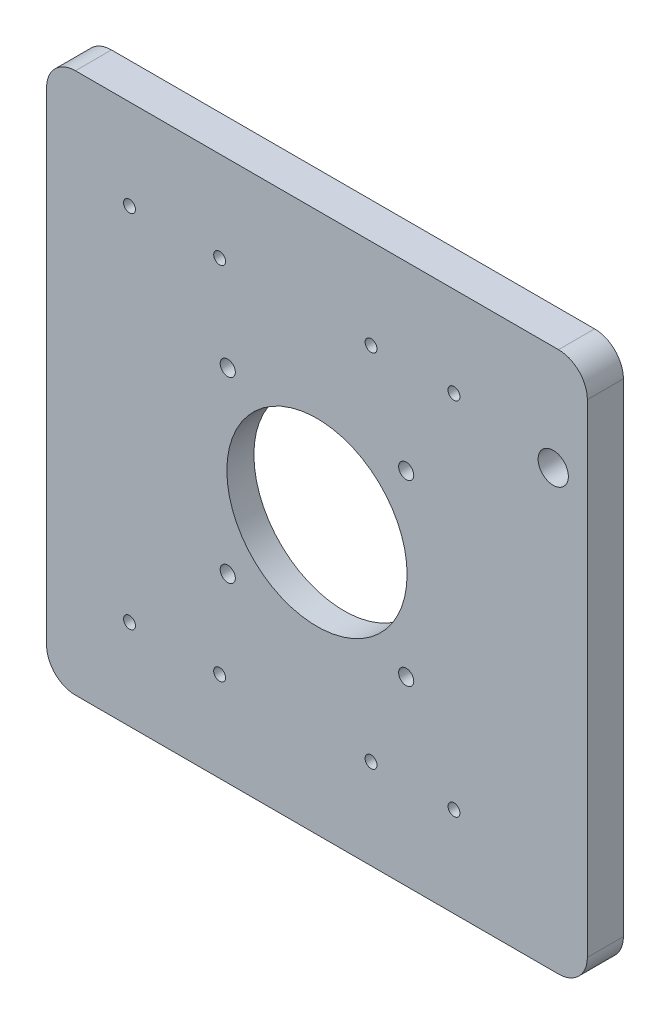
ISO-10303-21;
HEADER;
FILE_DESCRIPTION(('STEP AP214'),'2;1');
FILE_NAME('part.step','',(''),(''),'','','');
FILE_SCHEMA(('AUTOMOTIVE_DESIGN { 1 0 10303 214 1 1 1 1 }'));
ENDSEC;
DATA;
#1=APPLICATION_CONTEXT('core data for automotive mechanical design processes');
#2=APPLICATION_PROTOCOL_DEFINITION('international standard','automotive_design',2000,#1);
#3=PRODUCT_CONTEXT('',#1,'mechanical');
#4=PRODUCT('Part','Part','',(#3));
#5=PRODUCT_RELATED_PRODUCT_CATEGORY('part','',(#4));
#6=PRODUCT_DEFINITION_FORMATION('','',#4);
#7=PRODUCT_DEFINITION_CONTEXT('part definition',#1,'design');
#8=PRODUCT_DEFINITION('design','',#6,#7);
#9=PRODUCT_DEFINITION_SHAPE('','',#8);
#10=(LENGTH_UNIT() NAMED_UNIT(*) SI_UNIT(.MILLI.,.METRE.));
#11=(NAMED_UNIT(*) PLANE_ANGLE_UNIT() SI_UNIT($,.RADIAN.));
#12=(NAMED_UNIT(*) SI_UNIT($,.STERADIAN.) SOLID_ANGLE_UNIT());
#13=UNCERTAINTY_MEASURE_WITH_UNIT(LENGTH_MEASURE(1.E-05),#10,'distance_accuracy_value','');
#14=(GEOMETRIC_REPRESENTATION_CONTEXT(3) GLOBAL_UNCERTAINTY_ASSIGNED_CONTEXT((#13)) GLOBAL_UNIT_ASSIGNED_CONTEXT((#10,
#11,#12)) REPRESENTATION_CONTEXT('',''));
#15=CARTESIAN_POINT('',(0.,0.,0.));
#16=DIRECTION('',(0.,0.,1.));
#17=DIRECTION('',(1.,0.,0.));
#18=AXIS2_PLACEMENT_3D('',#15,#16,#17);
#19=CARTESIAN_POINT('',(0.,0.,2.5));
#20=DIRECTION('',(0.,0.,-1.));
#21=DIRECTION('',(-1.,0.,0.));
#22=AXIS2_PLACEMENT_3D('',#19,#20,#21);
#23=CYLINDRICAL_SURFACE('',#22,50.);
#24=CARTESIAN_POINT('',(0.,0.,0.));
#25=DIRECTION('',(0.,0.,-1.));
#26=DIRECTION('',(-1.,0.,0.));
#27=AXIS2_PLACEMENT_3D('',#24,#25,#26);
#28=CIRCLE('',#27,50.);
#29=CARTESIAN_POINT('',(-50.,0.,0.));
#30=VERTEX_POINT('',#29);
#31=EDGE_CURVE('E19',#30,#30,#28,.T.);
#32=ORIENTED_EDGE('',*,*,#31,.T.);
#33=EDGE_LOOP('',(#32));
#34=FACE_BOUND('',#33,.T.);
#35=CARTESIAN_POINT('',(0.,0.,2.5));
#36=DIRECTION('',(0.,0.,-1.));
#37=DIRECTION('',(-1.,0.,0.));
#38=AXIS2_PLACEMENT_3D('',#35,#36,#37);
#39=CIRCLE('',#38,50.);
#40=CARTESIAN_POINT('',(-50.,0.,2.5));
#41=VERTEX_POINT('',#40);
#42=EDGE_CURVE('E215',#41,#41,#39,.T.);
#43=ORIENTED_EDGE('',*,*,#42,.F.);
#44=EDGE_LOOP('',(#43));
#45=FACE_BOUND('',#44,.T.);
#46=ADVANCED_FACE('F16',(#34,#45),#23,.F.);
#47=CARTESIAN_POINT('',(-67.,67.,0.));
#48=DIRECTION('',(0.,0.,1.));
#49=DIRECTION('',(1.,0.,0.));
#50=AXIS2_PLACEMENT_3D('',#47,#48,#49);
#51=PLANE('',#50);
#52=DIRECTION('',(1.,0.,0.));
#53=VECTOR('',#52,1.);
#54=CARTESIAN_POINT('',(-67.,75.,0.));
#55=LINE('',#54,#53);
#56=CARTESIAN_POINT('',(-67.,75.,0.));
#57=VERTEX_POINT('',#56);
#58=CARTESIAN_POINT('',(67.,75.,0.));
#59=VERTEX_POINT('',#58);
#60=EDGE_CURVE('E84',#57,#59,#55,.T.);
#61=ORIENTED_EDGE('',*,*,#60,.T.);
#62=CARTESIAN_POINT('',(67.,67.,0.));
#63=DIRECTION('',(0.,0.,-1.));
#64=DIRECTION('',(-1.,0.,0.));
#65=AXIS2_PLACEMENT_3D('',#62,#63,#64);
#66=CIRCLE('',#65,7.99999999999999);
#67=CARTESIAN_POINT('',(75.,67.,0.));
#68=VERTEX_POINT('',#67);
#69=EDGE_CURVE('E112',#68,#59,#66,.F.);
#70=ORIENTED_EDGE('',*,*,#69,.F.);
#71=DIRECTION('',(0.,-1.,0.));
#72=VECTOR('',#71,1.);
#73=CARTESIAN_POINT('',(75.,67.,0.));
#74=LINE('',#73,#72);
#75=CARTESIAN_POINT('',(75.,-67.,0.));
#76=VERTEX_POINT('',#75);
#77=EDGE_CURVE('E109',#68,#76,#74,.T.);
#78=ORIENTED_EDGE('',*,*,#77,.T.);
#79=CARTESIAN_POINT('',(67.,-67.,0.));
#80=DIRECTION('',(0.,0.,-1.));
#81=DIRECTION('',(-1.,0.,0.));
#82=AXIS2_PLACEMENT_3D('',#79,#80,#81);
#83=CIRCLE('',#82,8.00000000000001);
#84=CARTESIAN_POINT('',(67.,-75.,0.));
#85=VERTEX_POINT('',#84);
#86=EDGE_CURVE('E117',#85,#76,#83,.F.);
#87=ORIENTED_EDGE('',*,*,#86,.F.);
#88=DIRECTION('',(-1.,0.,0.));
#89=VECTOR('',#88,1.);
#90=CARTESIAN_POINT('',(67.,-75.,0.));
#91=LINE('',#90,#89);
#92=CARTESIAN_POINT('',(-67.,-75.,0.));
#93=VERTEX_POINT('',#92);
#94=EDGE_CURVE('E114',#85,#93,#91,.T.);
#95=ORIENTED_EDGE('',*,*,#94,.T.);
#96=CARTESIAN_POINT('',(-67.,-67.,0.));
#97=DIRECTION('',(0.,0.,-1.));
#98=DIRECTION('',(-1.,0.,0.));
#99=AXIS2_PLACEMENT_3D('',#96,#97,#98);
#100=CIRCLE('',#99,7.99999999999999);
#101=CARTESIAN_POINT('',(-75.,-67.,0.));
#102=VERTEX_POINT('',#101);
#103=EDGE_CURVE('E119',#102,#93,#100,.F.);
#104=ORIENTED_EDGE('',*,*,#103,.F.);
#105=DIRECTION('',(0.,1.,0.));
#106=VECTOR('',#105,1.);
#107=CARTESIAN_POINT('',(-75.,-67.,0.));
#108=LINE('',#107,#106);
#109=CARTESIAN_POINT('',(-75.,67.,0.));
#110=VERTEX_POINT('',#109);
#111=EDGE_CURVE('E86',#102,#110,#108,.T.);
#112=ORIENTED_EDGE('',*,*,#111,.T.);
#113=CARTESIAN_POINT('',(-67.,67.,0.));
#114=DIRECTION('',(0.,0.,-1.));
#115=DIRECTION('',(-1.,0.,0.));
#116=AXIS2_PLACEMENT_3D('',#113,#114,#115);
#117=CIRCLE('',#116,7.99999999999998);
#118=EDGE_CURVE('E79',#57,#110,#117,.F.);
#119=ORIENTED_EDGE('',*,*,#118,.F.);
#120=EDGE_LOOP('',(#61,#70,#78,#87,#95,#104,#112,#119));
#121=FACE_BOUND('',#120,.T.);
#122=CARTESIAN_POINT('',(-27.,50.,0.));
#123=DIRECTION('',(0.,0.,1.));
#124=DIRECTION('',(1.,0.,0.));
#125=AXIS2_PLACEMENT_3D('',#122,#123,#124);
#126=CIRCLE('',#125,1.65);
#127=CARTESIAN_POINT('',(-25.35,50.,0.));
#128=VERTEX_POINT('',#127);
#129=EDGE_CURVE('E90',#128,#128,#126,.T.);
#130=ORIENTED_EDGE('',*,*,#129,.T.);
#131=EDGE_LOOP('',(#130));
#132=FACE_BOUND('',#131,.T.);
#133=CARTESIAN_POINT('',(-27.,-50.,0.));
#134=DIRECTION('',(0.,0.,1.));
#135=DIRECTION('',(1.,0.,0.));
#136=AXIS2_PLACEMENT_3D('',#133,#134,#135);
#137=CIRCLE('',#136,1.65);
#138=CARTESIAN_POINT('',(-25.35,-50.,0.));
#139=VERTEX_POINT('',#138);
#140=EDGE_CURVE('E180',#139,#139,#137,.T.);
#141=ORIENTED_EDGE('',*,*,#140,.T.);
#142=EDGE_LOOP('',(#141));
#143=FACE_BOUND('',#142,.T.);
#144=CARTESIAN_POINT('',(15.,-50.,0.));
#145=DIRECTION('',(0.,0.,1.));
#146=DIRECTION('',(1.,0.,0.));
#147=AXIS2_PLACEMENT_3D('',#144,#145,#146);
#148=CIRCLE('',#147,1.65);
#149=CARTESIAN_POINT('',(16.65,-50.,0.));
#150=VERTEX_POINT('',#149);
#151=EDGE_CURVE('E183',#150,#150,#148,.T.);
#152=ORIENTED_EDGE('',*,*,#151,.T.);
#153=EDGE_LOOP('',(#152));
#154=FACE_BOUND('',#153,.T.);
#155=CARTESIAN_POINT('',(15.,50.,0.));
#156=DIRECTION('',(0.,0.,1.));
#157=DIRECTION('',(1.,0.,0.));
#158=AXIS2_PLACEMENT_3D('',#155,#156,#157);
#159=CIRCLE('',#158,1.65);
#160=CARTESIAN_POINT('',(16.65,50.,0.));
#161=VERTEX_POINT('',#160);
#162=EDGE_CURVE('E186',#161,#161,#159,.T.);
#163=ORIENTED_EDGE('',*,*,#162,.T.);
#164=EDGE_LOOP('',(#163));
#165=FACE_BOUND('',#164,.T.);
#166=CARTESIAN_POINT('',(38.,-50.,0.));
#167=DIRECTION('',(0.,0.,1.));
#168=DIRECTION('',(1.,0.,0.));
#169=AXIS2_PLACEMENT_3D('',#166,#167,#168);
#170=CIRCLE('',#169,1.65);
#171=CARTESIAN_POINT('',(39.65,-50.,0.));
#172=VERTEX_POINT('',#171);
#173=EDGE_CURVE('E189',#172,#172,#170,.T.);
#174=ORIENTED_EDGE('',*,*,#173,.T.);
#175=EDGE_LOOP('',(#174));
#176=FACE_BOUND('',#175,.T.);
#177=CARTESIAN_POINT('',(-52.,-50.,0.));
#178=DIRECTION('',(0.,0.,1.));
#179=DIRECTION('',(1.,0.,0.));
#180=AXIS2_PLACEMENT_3D('',#177,#178,#179);
#181=CIRCLE('',#180,1.65);
#182=CARTESIAN_POINT('',(-50.35,-50.,0.));
#183=VERTEX_POINT('',#182);
#184=EDGE_CURVE('E192',#183,#183,#181,.T.);
#185=ORIENTED_EDGE('',*,*,#184,.T.);
#186=EDGE_LOOP('',(#185));
#187=FACE_BOUND('',#186,.T.);
#188=CARTESIAN_POINT('',(38.,50.,0.));
#189=DIRECTION('',(0.,0.,1.));
#190=DIRECTION('',(1.,0.,0.));
#191=AXIS2_PLACEMENT_3D('',#188,#189,#190);
#192=CIRCLE('',#191,1.65);
#193=CARTESIAN_POINT('',(39.65,50.,0.));
#194=VERTEX_POINT('',#193);
#195=EDGE_CURVE('E195',#194,#194,#192,.T.);
#196=ORIENTED_EDGE('',*,*,#195,.T.);
#197=EDGE_LOOP('',(#196));
#198=FACE_BOUND('',#197,.T.);
#199=CARTESIAN_POINT('',(-52.,50.,0.));
#200=DIRECTION('',(0.,0.,1.));
#201=DIRECTION('',(1.,0.,0.));
#202=AXIS2_PLACEMENT_3D('',#199,#200,#201);
#203=CIRCLE('',#202,1.65);
#204=CARTESIAN_POINT('',(-50.35,50.,0.));
#205=VERTEX_POINT('',#204);
#206=EDGE_CURVE('E198',#205,#205,#203,.T.);
#207=ORIENTED_EDGE('',*,*,#206,.T.);
#208=EDGE_LOOP('',(#207));
#209=FACE_BOUND('',#208,.T.);
#210=ORIENTED_EDGE('',*,*,#31,.F.);
#211=EDGE_LOOP('',(#210));
#212=FACE_BOUND('',#211,.T.);
#213=CARTESIAN_POINT('',(65.5321635431193,45.8861149080838,0.));
#214=DIRECTION('',(0.,0.,1.));
#215=DIRECTION('',(1.,0.,0.));
#216=AXIS2_PLACEMENT_3D('',#213,#214,#215);
#217=CIRCLE('',#216,4.2);
#218=CARTESIAN_POINT('',(69.7321635431193,45.8861149080838,0.));
#219=VERTEX_POINT('',#218);
#220=EDGE_CURVE('E201',#219,#219,#217,.T.);
#221=ORIENTED_EDGE('',*,*,#220,.T.);
#222=EDGE_LOOP('',(#221));
#223=FACE_BOUND('',#222,.T.);
#224=ADVANCED_FACE('F81',(#121,#132,#143,#154,#165,#176,#187,#198,#209,#212,#223),#51,.F.);
#225=CARTESIAN_POINT('',(0.,0.,2.5));
#226=DIRECTION('',(0.,0.,-1.));
#227=DIRECTION('',(-1.,0.,0.));
#228=AXIS2_PLACEMENT_3D('',#225,#226,#227);
#229=PLANE('',#228);
#230=ORIENTED_EDGE('',*,*,#42,.T.);
#231=EDGE_LOOP('',(#230));
#232=FACE_BOUND('',#231,.T.);
#233=CARTESIAN_POINT('',(0.,0.,2.5));
#234=DIRECTION('',(0.,0.,-1.));
#235=DIRECTION('',(-1.,0.,0.));
#236=AXIS2_PLACEMENT_3D('',#233,#234,#235);
#237=CIRCLE('',#236,25.);
#238=CARTESIAN_POINT('',(-25.,0.,2.5));
#239=VERTEX_POINT('',#238);
#240=EDGE_CURVE('E101',#239,#239,#237,.F.);
#241=ORIENTED_EDGE('',*,*,#240,.T.);
#242=EDGE_LOOP('',(#241));
#243=FACE_BOUND('',#242,.T.);
#244=CARTESIAN_POINT('',(24.75,-24.75,2.5));
#245=DIRECTION('',(0.,0.,1.));
#246=DIRECTION('',(1.,0.,0.));
#247=AXIS2_PLACEMENT_3D('',#244,#245,#246);
#248=CIRCLE('',#247,2.09999999999999);
#249=CARTESIAN_POINT('',(26.85,-24.75,2.5));
#250=VERTEX_POINT('',#249);
#251=EDGE_CURVE('E204',#250,#250,#248,.T.);
#252=ORIENTED_EDGE('',*,*,#251,.T.);
#253=EDGE_LOOP('',(#252));
#254=FACE_BOUND('',#253,.T.);
#255=CARTESIAN_POINT('',(-24.75,-24.75,2.5));
#256=DIRECTION('',(0.,0.,1.));
#257=DIRECTION('',(1.,0.,0.));
#258=AXIS2_PLACEMENT_3D('',#255,#256,#257);
#259=CIRCLE('',#258,2.09999999999999);
#260=CARTESIAN_POINT('',(-22.65,-24.75,2.5));
#261=VERTEX_POINT('',#260);
#262=EDGE_CURVE('E207',#261,#261,#259,.T.);
#263=ORIENTED_EDGE('',*,*,#262,.T.);
#264=EDGE_LOOP('',(#263));
#265=FACE_BOUND('',#264,.T.);
#266=CARTESIAN_POINT('',(24.75,24.75,2.5));
#267=DIRECTION('',(0.,0.,1.));
#268=DIRECTION('',(1.,0.,0.));
#269=AXIS2_PLACEMENT_3D('',#266,#267,#268);
#270=CIRCLE('',#269,2.09999999999999);
#271=CARTESIAN_POINT('',(26.85,24.75,2.5));
#272=VERTEX_POINT('',#271);
#273=EDGE_CURVE('E210',#272,#272,#270,.T.);
#274=ORIENTED_EDGE('',*,*,#273,.T.);
#275=EDGE_LOOP('',(#274));
#276=FACE_BOUND('',#275,.T.);
#277=CARTESIAN_POINT('',(-24.75,24.75,2.5));
#278=DIRECTION('',(0.,0.,1.));
#279=DIRECTION('',(1.,0.,0.));
#280=AXIS2_PLACEMENT_3D('',#277,#278,#279);
#281=CIRCLE('',#280,2.09999999999999);
#282=CARTESIAN_POINT('',(-22.65,24.75,2.5));
#283=VERTEX_POINT('',#282);
#284=EDGE_CURVE('E213',#283,#283,#281,.T.);
#285=ORIENTED_EDGE('',*,*,#284,.T.);
#286=EDGE_LOOP('',(#285));
#287=FACE_BOUND('',#286,.T.);
#288=ADVANCED_FACE('F226',(#232,#243,#254,#265,#276,#287),#229,.T.);
#289=CARTESIAN_POINT('',(-24.75,24.75,10.));
#290=DIRECTION('',(0.,0.,1.));
#291=DIRECTION('',(1.,0.,0.));
#292=AXIS2_PLACEMENT_3D('',#289,#290,#291);
#293=CYLINDRICAL_SURFACE('',#292,2.09999999999999);
#294=CARTESIAN_POINT('',(-24.75,24.75,10.));
#295=DIRECTION('',(0.,0.,1.));
#296=DIRECTION('',(1.,0.,0.));
#297=AXIS2_PLACEMENT_3D('',#294,#295,#296);
#298=CIRCLE('',#297,2.09999999999999);
#299=CARTESIAN_POINT('',(-22.65,24.75,10.));
#300=VERTEX_POINT('',#299);
#301=EDGE_CURVE('E104',#300,#300,#298,.F.);
#302=ORIENTED_EDGE('',*,*,#301,.F.);
#303=EDGE_LOOP('',(#302));
#304=FACE_BOUND('',#303,.T.);
#305=ORIENTED_EDGE('',*,*,#284,.F.);
#306=EDGE_LOOP('',(#305));
#307=FACE_BOUND('',#306,.T.);
#308=ADVANCED_FACE('F334',(#304,#307),#293,.F.);
#309=CARTESIAN_POINT('',(24.75,24.75,10.));
#310=DIRECTION('',(0.,0.,1.));
#311=DIRECTION('',(1.,0.,0.));
#312=AXIS2_PLACEMENT_3D('',#309,#310,#311);
#313=CYLINDRICAL_SURFACE('',#312,2.09999999999999);
#314=CARTESIAN_POINT('',(24.75,24.75,10.));
#315=DIRECTION('',(0.,0.,1.));
#316=DIRECTION('',(1.,0.,0.));
#317=AXIS2_PLACEMENT_3D('',#314,#315,#316);
#318=CIRCLE('',#317,2.09999999999999);
#319=CARTESIAN_POINT('',(26.85,24.75,10.));
#320=VERTEX_POINT('',#319);
#321=EDGE_CURVE('E167',#320,#320,#318,.F.);
#322=ORIENTED_EDGE('',*,*,#321,.F.);
#323=EDGE_LOOP('',(#322));
#324=FACE_BOUND('',#323,.T.);
#325=ORIENTED_EDGE('',*,*,#273,.F.);
#326=EDGE_LOOP('',(#325));
#327=FACE_BOUND('',#326,.T.);
#328=ADVANCED_FACE('F337',(#324,#327),#313,.F.);
#329=CARTESIAN_POINT('',(-24.75,-24.75,10.));
#330=DIRECTION('',(0.,0.,1.));
#331=DIRECTION('',(1.,0.,0.));
#332=AXIS2_PLACEMENT_3D('',#329,#330,#331);
#333=CYLINDRICAL_SURFACE('',#332,2.09999999999999);
#334=CARTESIAN_POINT('',(-24.75,-24.75,10.));
#335=DIRECTION('',(0.,0.,1.));
#336=DIRECTION('',(1.,0.,0.));
#337=AXIS2_PLACEMENT_3D('',#334,#335,#336);
#338=CIRCLE('',#337,2.09999999999999);
#339=CARTESIAN_POINT('',(-22.65,-24.75,10.));
#340=VERTEX_POINT('',#339);
#341=EDGE_CURVE('E164',#340,#340,#338,.F.);
#342=ORIENTED_EDGE('',*,*,#341,.F.);
#343=EDGE_LOOP('',(#342));
#344=FACE_BOUND('',#343,.T.);
#345=ORIENTED_EDGE('',*,*,#262,.F.);
#346=EDGE_LOOP('',(#345));
#347=FACE_BOUND('',#346,.T.);
#348=ADVANCED_FACE('F243',(#344,#347),#333,.F.);
#349=CARTESIAN_POINT('',(24.75,-24.75,10.));
#350=DIRECTION('',(0.,0.,1.));
#351=DIRECTION('',(1.,0.,0.));
#352=AXIS2_PLACEMENT_3D('',#349,#350,#351);
#353=CYLINDRICAL_SURFACE('',#352,2.09999999999999);
#354=CARTESIAN_POINT('',(24.75,-24.75,10.));
#355=DIRECTION('',(0.,0.,1.));
#356=DIRECTION('',(1.,0.,0.));
#357=AXIS2_PLACEMENT_3D('',#354,#355,#356);
#358=CIRCLE('',#357,2.09999999999999);
#359=CARTESIAN_POINT('',(26.85,-24.75,10.));
#360=VERTEX_POINT('',#359);
#361=EDGE_CURVE('E161',#360,#360,#358,.F.);
#362=ORIENTED_EDGE('',*,*,#361,.F.);
#363=EDGE_LOOP('',(#362));
#364=FACE_BOUND('',#363,.T.);
#365=ORIENTED_EDGE('',*,*,#251,.F.);
#366=EDGE_LOOP('',(#365));
#367=FACE_BOUND('',#366,.T.);
#368=ADVANCED_FACE('F232',(#364,#367),#353,.F.);
#369=CARTESIAN_POINT('',(65.5321635431193,45.8861149080838,10.));
#370=DIRECTION('',(0.,0.,1.));
#371=DIRECTION('',(1.,0.,0.));
#372=AXIS2_PLACEMENT_3D('',#369,#370,#371);
#373=CYLINDRICAL_SURFACE('',#372,4.2);
#374=CARTESIAN_POINT('',(65.5321635431193,45.8861149080838,10.));
#375=DIRECTION('',(0.,0.,1.));
#376=DIRECTION('',(1.,0.,0.));
#377=AXIS2_PLACEMENT_3D('',#374,#375,#376);
#378=CIRCLE('',#377,4.2);
#379=CARTESIAN_POINT('',(69.7321635431193,45.8861149080838,10.));
#380=VERTEX_POINT('',#379);
#381=EDGE_CURVE('E158',#380,#380,#378,.F.);
#382=ORIENTED_EDGE('',*,*,#381,.F.);
#383=EDGE_LOOP('',(#382));
#384=FACE_BOUND('',#383,.T.);
#385=ORIENTED_EDGE('',*,*,#220,.F.);
#386=EDGE_LOOP('',(#385));
#387=FACE_BOUND('',#386,.T.);
#388=ADVANCED_FACE('F229',(#384,#387),#373,.F.);
#389=CARTESIAN_POINT('',(-52.,50.,10.));
#390=DIRECTION('',(0.,0.,1.));
#391=DIRECTION('',(1.,0.,0.));
#392=AXIS2_PLACEMENT_3D('',#389,#390,#391);
#393=CYLINDRICAL_SURFACE('',#392,1.65);
#394=CARTESIAN_POINT('',(-52.,50.,10.));
#395=DIRECTION('',(0.,0.,1.));
#396=DIRECTION('',(1.,0.,0.));
#397=AXIS2_PLACEMENT_3D('',#394,#395,#396);
#398=CIRCLE('',#397,1.65);
#399=CARTESIAN_POINT('',(-50.35,50.,10.));
#400=VERTEX_POINT('',#399);
#401=EDGE_CURVE('E155',#400,#400,#398,.F.);
#402=ORIENTED_EDGE('',*,*,#401,.F.);
#403=EDGE_LOOP('',(#402));
#404=FACE_BOUND('',#403,.T.);
#405=ORIENTED_EDGE('',*,*,#206,.F.);
#406=EDGE_LOOP('',(#405));
#407=FACE_BOUND('',#406,.T.);
#408=ADVANCED_FACE('F231',(#404,#407),#393,.F.);
#409=CARTESIAN_POINT('',(38.,50.,10.));
#410=DIRECTION('',(0.,0.,1.));
#411=DIRECTION('',(1.,0.,0.));
#412=AXIS2_PLACEMENT_3D('',#409,#410,#411);
#413=CYLINDRICAL_SURFACE('',#412,1.65);
#414=CARTESIAN_POINT('',(38.,50.,10.));
#415=DIRECTION('',(0.,0.,1.));
#416=DIRECTION('',(1.,0.,0.));
#417=AXIS2_PLACEMENT_3D('',#414,#415,#416);
#418=CIRCLE('',#417,1.65);
#419=CARTESIAN_POINT('',(39.65,50.,10.));
#420=VERTEX_POINT('',#419);
#421=EDGE_CURVE('E152',#420,#420,#418,.F.);
#422=ORIENTED_EDGE('',*,*,#421,.F.);
#423=EDGE_LOOP('',(#422));
#424=FACE_BOUND('',#423,.T.);
#425=ORIENTED_EDGE('',*,*,#195,.F.);
#426=EDGE_LOOP('',(#425));
#427=FACE_BOUND('',#426,.T.);
#428=ADVANCED_FACE('F240',(#424,#427),#413,.F.);
#429=CARTESIAN_POINT('',(-52.,-50.,10.));
#430=DIRECTION('',(0.,0.,1.));
#431=DIRECTION('',(1.,0.,0.));
#432=AXIS2_PLACEMENT_3D('',#429,#430,#431);
#433=CYLINDRICAL_SURFACE('',#432,1.65);
#434=CARTESIAN_POINT('',(-52.,-50.,10.));
#435=DIRECTION('',(0.,0.,1.));
#436=DIRECTION('',(1.,0.,0.));
#437=AXIS2_PLACEMENT_3D('',#434,#435,#436);
#438=CIRCLE('',#437,1.65);
#439=CARTESIAN_POINT('',(-50.35,-50.,10.));
#440=VERTEX_POINT('',#439);
#441=EDGE_CURVE('E149',#440,#440,#438,.F.);
#442=ORIENTED_EDGE('',*,*,#441,.F.);
#443=EDGE_LOOP('',(#442));
#444=FACE_BOUND('',#443,.T.);
#445=ORIENTED_EDGE('',*,*,#184,.F.);
#446=EDGE_LOOP('',(#445));
#447=FACE_BOUND('',#446,.T.);
#448=ADVANCED_FACE('F305',(#444,#447),#433,.F.);
#449=CARTESIAN_POINT('',(38.,-50.,10.));
#450=DIRECTION('',(0.,0.,1.));
#451=DIRECTION('',(1.,0.,0.));
#452=AXIS2_PLACEMENT_3D('',#449,#450,#451);
#453=CYLINDRICAL_SURFACE('',#452,1.65);
#454=CARTESIAN_POINT('',(38.,-50.,10.));
#455=DIRECTION('',(0.,0.,1.));
#456=DIRECTION('',(1.,0.,0.));
#457=AXIS2_PLACEMENT_3D('',#454,#455,#456);
#458=CIRCLE('',#457,1.65);
#459=CARTESIAN_POINT('',(39.65,-50.,10.));
#460=VERTEX_POINT('',#459);
#461=EDGE_CURVE('E146',#460,#460,#458,.F.);
#462=ORIENTED_EDGE('',*,*,#461,.F.);
#463=EDGE_LOOP('',(#462));
#464=FACE_BOUND('',#463,.T.);
#465=ORIENTED_EDGE('',*,*,#173,.F.);
#466=EDGE_LOOP('',(#465));
#467=FACE_BOUND('',#466,.T.);
#468=ADVANCED_FACE('F301',(#464,#467),#453,.F.);
#469=CARTESIAN_POINT('',(15.,50.,10.));
#470=DIRECTION('',(0.,0.,1.));
#471=DIRECTION('',(1.,0.,0.));
#472=AXIS2_PLACEMENT_3D('',#469,#470,#471);
#473=CYLINDRICAL_SURFACE('',#472,1.65);
#474=CARTESIAN_POINT('',(15.,50.,10.));
#475=DIRECTION('',(0.,0.,1.));
#476=DIRECTION('',(1.,0.,0.));
#477=AXIS2_PLACEMENT_3D('',#474,#475,#476);
#478=CIRCLE('',#477,1.65);
#479=CARTESIAN_POINT('',(16.65,50.,10.));
#480=VERTEX_POINT('',#479);
#481=EDGE_CURVE('E143',#480,#480,#478,.F.);
#482=ORIENTED_EDGE('',*,*,#481,.F.);
#483=EDGE_LOOP('',(#482));
#484=FACE_BOUND('',#483,.T.);
#485=ORIENTED_EDGE('',*,*,#162,.F.);
#486=EDGE_LOOP('',(#485));
#487=FACE_BOUND('',#486,.T.);
#488=ADVANCED_FACE('F297',(#484,#487),#473,.F.);
#489=CARTESIAN_POINT('',(15.,-50.,10.));
#490=DIRECTION('',(0.,0.,1.));
#491=DIRECTION('',(1.,0.,0.));
#492=AXIS2_PLACEMENT_3D('',#489,#490,#491);
#493=CYLINDRICAL_SURFACE('',#492,1.65);
#494=CARTESIAN_POINT('',(15.,-50.,10.));
#495=DIRECTION('',(0.,0.,1.));
#496=DIRECTION('',(1.,0.,0.));
#497=AXIS2_PLACEMENT_3D('',#494,#495,#496);
#498=CIRCLE('',#497,1.65);
#499=CARTESIAN_POINT('',(16.65,-50.,10.));
#500=VERTEX_POINT('',#499);
#501=EDGE_CURVE('E140',#500,#500,#498,.F.);
#502=ORIENTED_EDGE('',*,*,#501,.F.);
#503=EDGE_LOOP('',(#502));
#504=FACE_BOUND('',#503,.T.);
#505=ORIENTED_EDGE('',*,*,#151,.F.);
#506=EDGE_LOOP('',(#505));
#507=FACE_BOUND('',#506,.T.);
#508=ADVANCED_FACE('F293',(#504,#507),#493,.F.);
#509=CARTESIAN_POINT('',(-27.,-50.,10.));
#510=DIRECTION('',(0.,0.,1.));
#511=DIRECTION('',(1.,0.,0.));
#512=AXIS2_PLACEMENT_3D('',#509,#510,#511);
#513=CYLINDRICAL_SURFACE('',#512,1.65);
#514=CARTESIAN_POINT('',(-27.,-50.,10.));
#515=DIRECTION('',(0.,0.,1.));
#516=DIRECTION('',(1.,0.,0.));
#517=AXIS2_PLACEMENT_3D('',#514,#515,#516);
#518=CIRCLE('',#517,1.65);
#519=CARTESIAN_POINT('',(-25.35,-50.,10.));
#520=VERTEX_POINT('',#519);
#521=EDGE_CURVE('E137',#520,#520,#518,.F.);
#522=ORIENTED_EDGE('',*,*,#521,.F.);
#523=EDGE_LOOP('',(#522));
#524=FACE_BOUND('',#523,.T.);
#525=ORIENTED_EDGE('',*,*,#140,.F.);
#526=EDGE_LOOP('',(#525));
#527=FACE_BOUND('',#526,.T.);
#528=ADVANCED_FACE('F289',(#524,#527),#513,.F.);
#529=CARTESIAN_POINT('',(-27.,50.,10.));
#530=DIRECTION('',(0.,0.,1.));
#531=DIRECTION('',(1.,0.,0.));
#532=AXIS2_PLACEMENT_3D('',#529,#530,#531);
#533=CYLINDRICAL_SURFACE('',#532,1.65);
#534=CARTESIAN_POINT('',(-27.,50.,10.));
#535=DIRECTION('',(0.,0.,1.));
#536=DIRECTION('',(1.,0.,0.));
#537=AXIS2_PLACEMENT_3D('',#534,#535,#536);
#538=CIRCLE('',#537,1.65);
#539=CARTESIAN_POINT('',(-25.35,50.,10.));
#540=VERTEX_POINT('',#539);
#541=EDGE_CURVE('E134',#540,#540,#538,.F.);
#542=ORIENTED_EDGE('',*,*,#541,.F.);
#543=EDGE_LOOP('',(#542));
#544=FACE_BOUND('',#543,.T.);
#545=ORIENTED_EDGE('',*,*,#129,.F.);
#546=EDGE_LOOP('',(#545));
#547=FACE_BOUND('',#546,.T.);
#548=ADVANCED_FACE('F286',(#544,#547),#533,.F.);
#549=CARTESIAN_POINT('',(-67.,67.,10.));
#550=DIRECTION('',(0.,0.,-1.));
#551=DIRECTION('',(-1.,0.,0.));
#552=AXIS2_PLACEMENT_3D('',#549,#550,#551);
#553=CYLINDRICAL_SURFACE('',#552,7.99999999999998);
#554=CARTESIAN_POINT('',(-67.,67.,10.));
#555=DIRECTION('',(0.,0.,-1.));
#556=DIRECTION('',(-1.,0.,0.));
#557=AXIS2_PLACEMENT_3D('',#554,#555,#556);
#558=CIRCLE('',#557,7.99999999999998);
#559=CARTESIAN_POINT('',(-67.,75.,10.));
#560=VERTEX_POINT('',#559);
#561=CARTESIAN_POINT('',(-75.,67.,10.));
#562=VERTEX_POINT('',#561);
#563=EDGE_CURVE('E96',#560,#562,#558,.F.);
#564=ORIENTED_EDGE('',*,*,#563,.F.);
#565=DIRECTION('',(0.,0.,1.));
#566=VECTOR('',#565,1.);
#567=CARTESIAN_POINT('',(-67.,75.,10.));
#568=LINE('',#567,#566);
#569=EDGE_CURVE('E93',#560,#57,#568,.F.);
#570=ORIENTED_EDGE('',*,*,#569,.T.);
#571=ORIENTED_EDGE('',*,*,#118,.T.);
#572=DIRECTION('',(0.,0.,-1.));
#573=VECTOR('',#572,1.);
#574=CARTESIAN_POINT('',(-75.,67.,10.));
#575=LINE('',#574,#573);
#576=EDGE_CURVE('E89',#110,#562,#575,.F.);
#577=ORIENTED_EDGE('',*,*,#576,.T.);
#578=EDGE_LOOP('',(#564,#570,#571,#577));
#579=FACE_BOUND('',#578,.T.);
#580=ADVANCED_FACE('F94',(#579),#553,.T.);
#581=CARTESIAN_POINT('',(-75.,-67.,10.));
#582=DIRECTION('',(1.,0.,0.));
#583=DIRECTION('',(0.,0.,-1.));
#584=AXIS2_PLACEMENT_3D('',#581,#582,#583);
#585=PLANE('',#584);
#586=DIRECTION('',(0.,0.,-1.));
#587=VECTOR('',#586,1.);
#588=CARTESIAN_POINT('',(-75.,-67.,10.));
#589=LINE('',#588,#587);
#590=CARTESIAN_POINT('',(-75.,-67.,10.));
#591=VERTEX_POINT('',#590);
#592=EDGE_CURVE('E176',#591,#102,#589,.T.);
#593=ORIENTED_EDGE('',*,*,#592,.F.);
#594=DIRECTION('',(0.,1.,0.));
#595=VECTOR('',#594,1.);
#596=CARTESIAN_POINT('',(-75.,67.,10.));
#597=LINE('',#596,#595);
#598=EDGE_CURVE('E132',#562,#591,#597,.F.);
#599=ORIENTED_EDGE('',*,*,#598,.F.);
#600=ORIENTED_EDGE('',*,*,#576,.F.);
#601=ORIENTED_EDGE('',*,*,#111,.F.);
#602=EDGE_LOOP('',(#593,#599,#600,#601));
#603=FACE_BOUND('',#602,.T.);
#604=ADVANCED_FACE('F279',(#603),#585,.F.);
#605=CARTESIAN_POINT('',(-67.,-67.,10.));
#606=DIRECTION('',(0.,0.,-1.));
#607=DIRECTION('',(-1.,0.,0.));
#608=AXIS2_PLACEMENT_3D('',#605,#606,#607);
#609=CYLINDRICAL_SURFACE('',#608,7.99999999999999);
#610=CARTESIAN_POINT('',(-67.,-67.,10.));
#611=DIRECTION('',(0.,0.,-1.));
#612=DIRECTION('',(-1.,0.,0.));
#613=AXIS2_PLACEMENT_3D('',#610,#611,#612);
#614=CIRCLE('',#613,7.99999999999999);
#615=CARTESIAN_POINT('',(-67.,-75.,10.));
#616=VERTEX_POINT('',#615);
#617=EDGE_CURVE('E129',#591,#616,#614,.F.);
#618=ORIENTED_EDGE('',*,*,#617,.F.);
#619=ORIENTED_EDGE('',*,*,#592,.T.);
#620=ORIENTED_EDGE('',*,*,#103,.T.);
#621=DIRECTION('',(0.,0.,1.));
#622=VECTOR('',#621,1.);
#623=CARTESIAN_POINT('',(-67.,-75.,10.));
#624=LINE('',#623,#622);
#625=EDGE_CURVE('E118',#93,#616,#624,.T.);
#626=ORIENTED_EDGE('',*,*,#625,.T.);
#627=EDGE_LOOP('',(#618,#619,#620,#626));
#628=FACE_BOUND('',#627,.T.);
#629=ADVANCED_FACE('F275',(#628),#609,.T.);
#630=CARTESIAN_POINT('',(67.,-75.,10.));
#631=DIRECTION('',(0.,1.,0.));
#632=DIRECTION('',(-1.,0.,0.));
#633=AXIS2_PLACEMENT_3D('',#630,#631,#632);
#634=PLANE('',#633);
#635=DIRECTION('',(0.,0.,-1.));
#636=VECTOR('',#635,1.);
#637=CARTESIAN_POINT('',(67.,-75.,10.));
#638=LINE('',#637,#636);
#639=CARTESIAN_POINT('',(67.,-75.,10.));
#640=VERTEX_POINT('',#639);
#641=EDGE_CURVE('E175',#640,#85,#638,.T.);
#642=ORIENTED_EDGE('',*,*,#641,.F.);
#643=DIRECTION('',(1.,0.,0.));
#644=VECTOR('',#643,1.);
#645=CARTESIAN_POINT('',(-67.,-75.,10.));
#646=LINE('',#645,#644);
#647=EDGE_CURVE('E128',#616,#640,#646,.T.);
#648=ORIENTED_EDGE('',*,*,#647,.F.);
#649=ORIENTED_EDGE('',*,*,#625,.F.);
#650=ORIENTED_EDGE('',*,*,#94,.F.);
#651=EDGE_LOOP('',(#642,#648,#649,#650));
#652=FACE_BOUND('',#651,.T.);
#653=ADVANCED_FACE('F271',(#652),#634,.F.);
#654=CARTESIAN_POINT('',(67.,-67.,10.));
#655=DIRECTION('',(0.,0.,-1.));
#656=DIRECTION('',(-1.,0.,0.));
#657=AXIS2_PLACEMENT_3D('',#654,#655,#656);
#658=CYLINDRICAL_SURFACE('',#657,8.00000000000001);
#659=CARTESIAN_POINT('',(67.,-67.,10.));
#660=DIRECTION('',(0.,0.,-1.));
#661=DIRECTION('',(-1.,0.,0.));
#662=AXIS2_PLACEMENT_3D('',#659,#660,#661);
#663=CIRCLE('',#662,8.00000000000001);
#664=CARTESIAN_POINT('',(75.,-67.,10.));
#665=VERTEX_POINT('',#664);
#666=EDGE_CURVE('E125',#640,#665,#663,.F.);
#667=ORIENTED_EDGE('',*,*,#666,.F.);
#668=ORIENTED_EDGE('',*,*,#641,.T.);
#669=ORIENTED_EDGE('',*,*,#86,.T.);
#670=DIRECTION('',(0.,0.,1.));
#671=VECTOR('',#670,1.);
#672=CARTESIAN_POINT('',(75.,-67.,10.));
#673=LINE('',#672,#671);
#674=EDGE_CURVE('E113',#76,#665,#673,.T.);
#675=ORIENTED_EDGE('',*,*,#674,.T.);
#676=EDGE_LOOP('',(#667,#668,#669,#675));
#677=FACE_BOUND('',#676,.T.);
#678=ADVANCED_FACE('F267',(#677),#658,.T.);
#679=CARTESIAN_POINT('',(75.,67.,10.));
#680=DIRECTION('',(-1.,0.,0.));
#681=DIRECTION('',(0.,-1.,0.));
#682=AXIS2_PLACEMENT_3D('',#679,#680,#681);
#683=PLANE('',#682);
#684=DIRECTION('',(0.,0.,-1.));
#685=VECTOR('',#684,1.);
#686=CARTESIAN_POINT('',(75.,67.,10.));
#687=LINE('',#686,#685);
#688=CARTESIAN_POINT('',(75.,67.,10.));
#689=VERTEX_POINT('',#688);
#690=EDGE_CURVE('E173',#689,#68,#687,.T.);
#691=ORIENTED_EDGE('',*,*,#690,.F.);
#692=DIRECTION('',(0.,1.,0.));
#693=VECTOR('',#692,1.);
#694=CARTESIAN_POINT('',(75.,67.,10.));
#695=LINE('',#694,#693);
#696=EDGE_CURVE('E124',#665,#689,#695,.T.);
#697=ORIENTED_EDGE('',*,*,#696,.F.);
#698=ORIENTED_EDGE('',*,*,#674,.F.);
#699=ORIENTED_EDGE('',*,*,#77,.F.);
#700=EDGE_LOOP('',(#691,#697,#698,#699));
#701=FACE_BOUND('',#700,.T.);
#702=ADVANCED_FACE('F264',(#701),#683,.F.);
#703=CARTESIAN_POINT('',(67.,67.,10.));
#704=DIRECTION('',(0.,0.,-1.));
#705=DIRECTION('',(-1.,0.,0.));
#706=AXIS2_PLACEMENT_3D('',#703,#704,#705);
#707=CYLINDRICAL_SURFACE('',#706,7.99999999999999);
#708=CARTESIAN_POINT('',(67.,67.,10.));
#709=DIRECTION('',(0.,0.,-1.));
#710=DIRECTION('',(-1.,0.,0.));
#711=AXIS2_PLACEMENT_3D('',#708,#709,#710);
#712=CIRCLE('',#711,7.99999999999999);
#713=CARTESIAN_POINT('',(67.,75.,10.));
#714=VERTEX_POINT('',#713);
#715=EDGE_CURVE('E121',#689,#714,#712,.F.);
#716=ORIENTED_EDGE('',*,*,#715,.F.);
#717=ORIENTED_EDGE('',*,*,#690,.T.);
#718=ORIENTED_EDGE('',*,*,#69,.T.);
#719=DIRECTION('',(0.,0.,1.));
#720=VECTOR('',#719,1.);
#721=CARTESIAN_POINT('',(67.,75.,10.));
#722=LINE('',#721,#720);
#723=EDGE_CURVE('E34',#59,#714,#722,.T.);
#724=ORIENTED_EDGE('',*,*,#723,.T.);
#725=EDGE_LOOP('',(#716,#717,#718,#724));
#726=FACE_BOUND('',#725,.T.);
#727=ADVANCED_FACE('F261',(#726),#707,.T.);
#728=CARTESIAN_POINT('',(-67.,75.,10.));
#729=DIRECTION('',(0.,-1.,0.));
#730=DIRECTION('',(1.,0.,0.));
#731=AXIS2_PLACEMENT_3D('',#728,#729,#730);
#732=PLANE('',#731);
#733=ORIENTED_EDGE('',*,*,#569,.F.);
#734=DIRECTION('',(1.,0.,0.));
#735=VECTOR('',#734,1.);
#736=CARTESIAN_POINT('',(-67.,75.,10.));
#737=LINE('',#736,#735);
#738=EDGE_CURVE('E25',#714,#560,#737,.F.);
#739=ORIENTED_EDGE('',*,*,#738,.F.);
#740=ORIENTED_EDGE('',*,*,#723,.F.);
#741=ORIENTED_EDGE('',*,*,#60,.F.);
#742=EDGE_LOOP('',(#733,#739,#740,#741));
#743=FACE_BOUND('',#742,.T.);
#744=ADVANCED_FACE('F100',(#743),#732,.F.);
#745=CARTESIAN_POINT('',(0.,0.,10.));
#746=DIRECTION('',(0.,0.,-1.));
#747=DIRECTION('',(-1.,0.,0.));
#748=AXIS2_PLACEMENT_3D('',#745,#746,#747);
#749=CYLINDRICAL_SURFACE('',#748,25.);
#750=CARTESIAN_POINT('',(0.,0.,10.));
#751=DIRECTION('',(0.,0.,-1.));
#752=DIRECTION('',(-1.,0.,0.));
#753=AXIS2_PLACEMENT_3D('',#750,#751,#752);
#754=CIRCLE('',#753,25.);
#755=CARTESIAN_POINT('',(-25.,0.,10.));
#756=VERTEX_POINT('',#755);
#757=EDGE_CURVE('E11',#756,#756,#754,.T.);
#758=ORIENTED_EDGE('',*,*,#757,.F.);
#759=EDGE_LOOP('',(#758));
#760=FACE_BOUND('',#759,.T.);
#761=ORIENTED_EDGE('',*,*,#240,.F.);
#762=EDGE_LOOP('',(#761));
#763=FACE_BOUND('',#762,.T.);
#764=ADVANCED_FACE('F249',(#760,#763),#749,.F.);
#765=CARTESIAN_POINT('',(-67.,67.,10.));
#766=DIRECTION('',(0.,0.,1.));
#767=DIRECTION('',(1.,0.,0.));
#768=AXIS2_PLACEMENT_3D('',#765,#766,#767);
#769=PLANE('',#768);
#770=ORIENTED_EDGE('',*,*,#757,.T.);
#771=EDGE_LOOP('',(#770));
#772=FACE_BOUND('',#771,.T.);
#773=ORIENTED_EDGE('',*,*,#715,.T.);
#774=ORIENTED_EDGE('',*,*,#738,.T.);
#775=ORIENTED_EDGE('',*,*,#563,.T.);
#776=ORIENTED_EDGE('',*,*,#598,.T.);
#777=ORIENTED_EDGE('',*,*,#617,.T.);
#778=ORIENTED_EDGE('',*,*,#647,.T.);
#779=ORIENTED_EDGE('',*,*,#666,.T.);
#780=ORIENTED_EDGE('',*,*,#696,.T.);
#781=EDGE_LOOP('',(#773,#774,#775,#776,#777,#778,#779,#780));
#782=FACE_BOUND('',#781,.T.);
#783=ORIENTED_EDGE('',*,*,#541,.T.);
#784=EDGE_LOOP('',(#783));
#785=FACE_BOUND('',#784,.T.);
#786=ORIENTED_EDGE('',*,*,#521,.T.);
#787=EDGE_LOOP('',(#786));
#788=FACE_BOUND('',#787,.T.);
#789=ORIENTED_EDGE('',*,*,#501,.T.);
#790=EDGE_LOOP('',(#789));
#791=FACE_BOUND('',#790,.T.);
#792=ORIENTED_EDGE('',*,*,#481,.T.);
#793=EDGE_LOOP('',(#792));
#794=FACE_BOUND('',#793,.T.);
#795=ORIENTED_EDGE('',*,*,#461,.T.);
#796=EDGE_LOOP('',(#795));
#797=FACE_BOUND('',#796,.T.);
#798=ORIENTED_EDGE('',*,*,#441,.T.);
#799=EDGE_LOOP('',(#798));
#800=FACE_BOUND('',#799,.T.);
#801=ORIENTED_EDGE('',*,*,#421,.T.);
#802=EDGE_LOOP('',(#801));
#803=FACE_BOUND('',#802,.T.);
#804=ORIENTED_EDGE('',*,*,#401,.T.);
#805=EDGE_LOOP('',(#804));
#806=FACE_BOUND('',#805,.T.);
#807=ORIENTED_EDGE('',*,*,#381,.T.);
#808=EDGE_LOOP('',(#807));
#809=FACE_BOUND('',#808,.T.);
#810=ORIENTED_EDGE('',*,*,#361,.T.);
#811=EDGE_LOOP('',(#810));
#812=FACE_BOUND('',#811,.T.);
#813=ORIENTED_EDGE('',*,*,#341,.T.);
#814=EDGE_LOOP('',(#813));
#815=FACE_BOUND('',#814,.T.);
#816=ORIENTED_EDGE('',*,*,#321,.T.);
#817=EDGE_LOOP('',(#816));
#818=FACE_BOUND('',#817,.T.);
#819=ORIENTED_EDGE('',*,*,#301,.T.);
#820=EDGE_LOOP('',(#819));
#821=FACE_BOUND('',#820,.T.);
#822=ADVANCED_FACE('F247',(#772,#782,#785,#788,#791,#794,#797,#800,#803,#806,#809,#812,#815,
#818,#821),#769,.T.);
#823=CLOSED_SHELL('',(#46,#224,#288,#308,#328,#348,#368,#388,#408,#428,#448,#468,#488,#508,#528,
#548,#580,#604,#629,#653,#678,#702,#727,#744,#764,#822));
#824=MANIFOLD_SOLID_BREP('B1',#823);
#825=ADVANCED_BREP_SHAPE_REPRESENTATION('',(#18,#824),#14);
#826=SHAPE_DEFINITION_REPRESENTATION(#9,#825);
ENDSEC;
END-ISO-10303-21;
